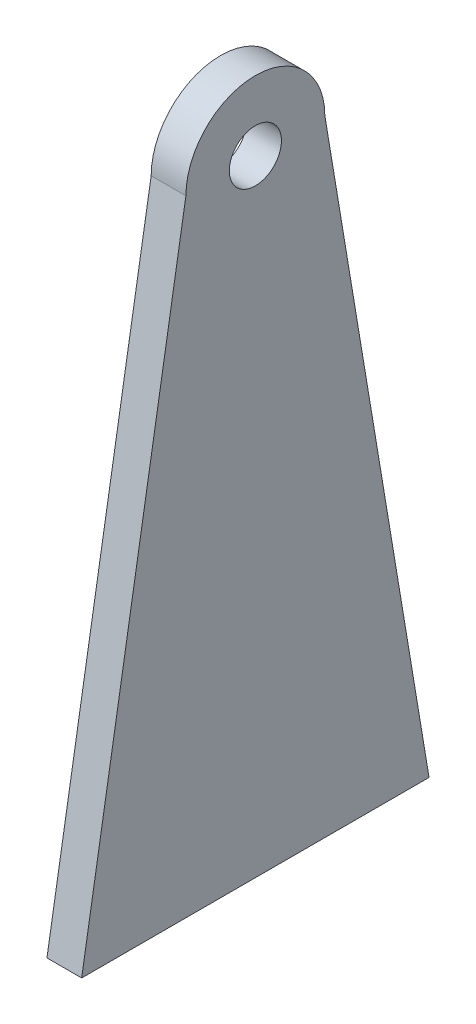
ISO-10303-21;
HEADER;
FILE_DESCRIPTION(('STEP AP214'),'2;1');
FILE_NAME('part.step','',(''),(''),'','','');
FILE_SCHEMA(('AUTOMOTIVE_DESIGN { 1 0 10303 214 1 1 1 1 }'));
ENDSEC;
DATA;
#1=APPLICATION_CONTEXT('core data for automotive mechanical design processes');
#2=APPLICATION_PROTOCOL_DEFINITION('international standard','automotive_design',2000,#1);
#3=PRODUCT_CONTEXT('',#1,'mechanical');
#4=PRODUCT('Part','Part','',(#3));
#5=PRODUCT_RELATED_PRODUCT_CATEGORY('part','',(#4));
#6=PRODUCT_DEFINITION_FORMATION('','',#4);
#7=PRODUCT_DEFINITION_CONTEXT('part definition',#1,'design');
#8=PRODUCT_DEFINITION('design','',#6,#7);
#9=PRODUCT_DEFINITION_SHAPE('','',#8);
#10=(LENGTH_UNIT() NAMED_UNIT(*) SI_UNIT(.MILLI.,.METRE.));
#11=(NAMED_UNIT(*) PLANE_ANGLE_UNIT() SI_UNIT($,.RADIAN.));
#12=(NAMED_UNIT(*) SI_UNIT($,.STERADIAN.) SOLID_ANGLE_UNIT());
#13=UNCERTAINTY_MEASURE_WITH_UNIT(LENGTH_MEASURE(1.E-05),#10,'distance_accuracy_value','');
#14=(GEOMETRIC_REPRESENTATION_CONTEXT(3) GLOBAL_UNCERTAINTY_ASSIGNED_CONTEXT((#13)) GLOBAL_UNIT_ASSIGNED_CONTEXT((#10,
#11,#12)) REPRESENTATION_CONTEXT('',''));
#15=CARTESIAN_POINT('',(0.,0.,0.));
#16=DIRECTION('',(0.,0.,1.));
#17=DIRECTION('',(1.,0.,0.));
#18=AXIS2_PLACEMENT_3D('',#15,#16,#17);
#19=CARTESIAN_POINT('',(5.,180.,0.));
#20=DIRECTION('',(1.,0.,0.));
#21=DIRECTION('',(0.,0.,-1.));
#22=AXIS2_PLACEMENT_3D('',#19,#20,#21);
#23=PLANE('',#22);
#24=DIRECTION('',(0.,0.986393923832144,0.164398987305357));
#25=VECTOR('',#24,1.);
#26=CARTESIAN_POINT('',(5.,0.,-50.));
#27=LINE('',#26,#25);
#28=CARTESIAN_POINT('',(5.,0.,-50.));
#29=VERTEX_POINT('',#28);
#30=CARTESIAN_POINT('',(5.,180.,-20.));
#31=VERTEX_POINT('',#30);
#32=EDGE_CURVE('E151',#29,#31,#27,.T.);
#33=ORIENTED_EDGE('',*,*,#32,.T.);
#34=CARTESIAN_POINT('',(5.,180.,0.));
#35=DIRECTION('',(1.,0.,0.));
#36=DIRECTION('',(0.,0.,-1.));
#37=AXIS2_PLACEMENT_3D('',#34,#35,#36);
#38=CIRCLE('',#37,20.);
#39=CARTESIAN_POINT('',(5.,180.,20.));
#40=VERTEX_POINT('',#39);
#41=EDGE_CURVE('E84',#31,#40,#38,.T.);
#42=ORIENTED_EDGE('',*,*,#41,.T.);
#43=DIRECTION('',(0.,-0.986393923832144,0.164398987305357));
#44=VECTOR('',#43,1.);
#45=CARTESIAN_POINT('',(5.,0.,50.));
#46=LINE('',#45,#44);
#47=CARTESIAN_POINT('',(5.,0.,50.));
#48=VERTEX_POINT('',#47);
#49=EDGE_CURVE('E154',#40,#48,#46,.T.);
#50=ORIENTED_EDGE('',*,*,#49,.T.);
#51=DIRECTION('',(0.,0.,-1.));
#52=VECTOR('',#51,1.);
#53=CARTESIAN_POINT('',(5.,0.,-50.));
#54=LINE('',#53,#52);
#55=EDGE_CURVE('E56',#48,#29,#54,.T.);
#56=ORIENTED_EDGE('',*,*,#55,.T.);
#57=EDGE_LOOP('',(#33,#42,#50,#56));
#58=FACE_BOUND('',#57,.T.);
#59=CARTESIAN_POINT('',(5.,180.,0.));
#60=DIRECTION('',(1.,0.,0.));
#61=DIRECTION('',(0.,0.,-1.));
#62=AXIS2_PLACEMENT_3D('',#59,#60,#61);
#63=CIRCLE('',#62,7.5);
#64=CARTESIAN_POINT('',(5.,180.,-7.5));
#65=VERTEX_POINT('',#64);
#66=EDGE_CURVE('E145',#65,#65,#63,.T.);
#67=ORIENTED_EDGE('',*,*,#66,.F.);
#68=EDGE_LOOP('',(#67));
#69=FACE_BOUND('',#68,.T.);
#70=ADVANCED_FACE('F32',(#58,#69),#23,.T.);
#71=CARTESIAN_POINT('',(-5.,180.,0.));
#72=DIRECTION('',(1.,0.,0.));
#73=DIRECTION('',(0.,0.,-1.));
#74=AXIS2_PLACEMENT_3D('',#71,#72,#73);
#75=PLANE('',#74);
#76=DIRECTION('',(0.,1.,0.));
#77=VECTOR('',#76,1.);
#78=CARTESIAN_POINT('',(-5.,39.,35.));
#79=LINE('',#78,#77);
#80=CARTESIAN_POINT('',(-5.,33.,35.));
#81=VERTEX_POINT('',#80);
#82=CARTESIAN_POINT('',(-5.,39.,35.));
#83=VERTEX_POINT('',#82);
#84=EDGE_CURVE('E132',#81,#83,#79,.T.);
#85=ORIENTED_EDGE('',*,*,#84,.F.);
#86=DIRECTION('',(0.,0.,1.));
#87=VECTOR('',#86,1.);
#88=CARTESIAN_POINT('',(-5.,33.,0.));
#89=LINE('',#88,#87);
#90=CARTESIAN_POINT('',(-5.,33.,-35.));
#91=VERTEX_POINT('',#90);
#92=EDGE_CURVE('E110',#91,#81,#89,.T.);
#93=ORIENTED_EDGE('',*,*,#92,.F.);
#94=DIRECTION('',(0.,-1.,0.));
#95=VECTOR('',#94,1.);
#96=CARTESIAN_POINT('',(-5.,33.,-35.));
#97=LINE('',#96,#95);
#98=CARTESIAN_POINT('',(-5.,39.,-35.));
#99=VERTEX_POINT('',#98);
#100=EDGE_CURVE('E127',#99,#91,#97,.T.);
#101=ORIENTED_EDGE('',*,*,#100,.F.);
#102=DIRECTION('',(0.,0.,-1.));
#103=VECTOR('',#102,1.);
#104=CARTESIAN_POINT('',(-5.,39.,-35.));
#105=LINE('',#104,#103);
#106=EDGE_CURVE('E134',#83,#99,#105,.T.);
#107=ORIENTED_EDGE('',*,*,#106,.F.);
#108=EDGE_LOOP('',(#85,#93,#101,#107));
#109=FACE_BOUND('',#108,.T.);
#110=DIRECTION('',(0.,0.986393923832144,0.164398987305357));
#111=VECTOR('',#110,1.);
#112=CARTESIAN_POINT('',(-5.,0.,-50.));
#113=LINE('',#112,#111);
#114=CARTESIAN_POINT('',(-5.,0.,-50.));
#115=VERTEX_POINT('',#114);
#116=CARTESIAN_POINT('',(-5.,180.,-20.));
#117=VERTEX_POINT('',#116);
#118=EDGE_CURVE('E148',#115,#117,#113,.T.);
#119=ORIENTED_EDGE('',*,*,#118,.F.);
#120=DIRECTION('',(0.,0.,-1.));
#121=VECTOR('',#120,1.);
#122=CARTESIAN_POINT('',(-5.,0.,-50.));
#123=LINE('',#122,#121);
#124=CARTESIAN_POINT('',(-5.,0.,50.));
#125=VERTEX_POINT('',#124);
#126=EDGE_CURVE('E77',#125,#115,#123,.T.);
#127=ORIENTED_EDGE('',*,*,#126,.F.);
#128=DIRECTION('',(0.,-0.986393923832144,0.164398987305357));
#129=VECTOR('',#128,1.);
#130=CARTESIAN_POINT('',(-5.,0.,50.));
#131=LINE('',#130,#129);
#132=CARTESIAN_POINT('',(-5.,180.,20.));
#133=VERTEX_POINT('',#132);
#134=EDGE_CURVE('E162',#133,#125,#131,.T.);
#135=ORIENTED_EDGE('',*,*,#134,.F.);
#136=CARTESIAN_POINT('',(-5.,180.,0.));
#137=DIRECTION('',(1.,0.,0.));
#138=DIRECTION('',(0.,0.,-1.));
#139=AXIS2_PLACEMENT_3D('',#136,#137,#138);
#140=CIRCLE('',#139,20.);
#141=EDGE_CURVE('E160',#117,#133,#140,.T.);
#142=ORIENTED_EDGE('',*,*,#141,.F.);
#143=EDGE_LOOP('',(#119,#127,#135,#142));
#144=FACE_BOUND('',#143,.T.);
#145=CARTESIAN_POINT('',(-5.,180.,0.));
#146=DIRECTION('',(1.,0.,0.));
#147=DIRECTION('',(0.,0.,-1.));
#148=AXIS2_PLACEMENT_3D('',#145,#146,#147);
#149=CIRCLE('',#148,7.5);
#150=CARTESIAN_POINT('',(-5.,180.,-7.5));
#151=VERTEX_POINT('',#150);
#152=EDGE_CURVE('E141',#151,#151,#149,.T.);
#153=ORIENTED_EDGE('',*,*,#152,.T.);
#154=EDGE_LOOP('',(#153));
#155=FACE_BOUND('',#154,.T.);
#156=ADVANCED_FACE('F175',(#109,#144,#155),#75,.F.);
#157=CARTESIAN_POINT('',(5.,0.,-50.));
#158=DIRECTION('',(0.,-0.164398987305357,0.986393923832144));
#159=DIRECTION('',(0.,-0.986393923832144,-0.164398987305357));
#160=AXIS2_PLACEMENT_3D('',#157,#158,#159);
#161=PLANE('',#160);
#162=ORIENTED_EDGE('',*,*,#118,.T.);
#163=DIRECTION('',(-1.,0.,0.));
#164=VECTOR('',#163,1.);
#165=CARTESIAN_POINT('',(5.,180.,-20.));
#166=LINE('',#165,#164);
#167=EDGE_CURVE('E11',#31,#117,#166,.T.);
#168=ORIENTED_EDGE('',*,*,#167,.F.);
#169=ORIENTED_EDGE('',*,*,#32,.F.);
#170=DIRECTION('',(-1.,0.,0.));
#171=VECTOR('',#170,1.);
#172=CARTESIAN_POINT('',(5.,0.,-50.));
#173=LINE('',#172,#171);
#174=EDGE_CURVE('E157',#29,#115,#173,.T.);
#175=ORIENTED_EDGE('',*,*,#174,.T.);
#176=EDGE_LOOP('',(#162,#168,#169,#175));
#177=FACE_BOUND('',#176,.T.);
#178=ADVANCED_FACE('F34',(#177),#161,.F.);
#179=CARTESIAN_POINT('',(5.,180.,0.));
#180=DIRECTION('',(-1.,0.,0.));
#181=DIRECTION('',(0.,0.,1.));
#182=AXIS2_PLACEMENT_3D('',#179,#180,#181);
#183=CYLINDRICAL_SURFACE('',#182,20.);
#184=ORIENTED_EDGE('',*,*,#141,.T.);
#185=DIRECTION('',(-1.,0.,0.));
#186=VECTOR('',#185,1.);
#187=CARTESIAN_POINT('',(5.,180.,20.));
#188=LINE('',#187,#186);
#189=EDGE_CURVE('E40',#40,#133,#188,.T.);
#190=ORIENTED_EDGE('',*,*,#189,.F.);
#191=ORIENTED_EDGE('',*,*,#41,.F.);
#192=ORIENTED_EDGE('',*,*,#167,.T.);
#193=EDGE_LOOP('',(#184,#190,#191,#192));
#194=FACE_BOUND('',#193,.T.);
#195=ADVANCED_FACE('F190',(#194),#183,.T.);
#196=CARTESIAN_POINT('',(5.,0.,50.));
#197=DIRECTION('',(0.,-0.164398987305357,-0.986393923832144));
#198=DIRECTION('',(0.,0.986393923832144,-0.164398987305357));
#199=AXIS2_PLACEMENT_3D('',#196,#197,#198);
#200=PLANE('',#199);
#201=ORIENTED_EDGE('',*,*,#134,.T.);
#202=DIRECTION('',(-1.,0.,0.));
#203=VECTOR('',#202,1.);
#204=CARTESIAN_POINT('',(5.,0.,50.));
#205=LINE('',#204,#203);
#206=EDGE_CURVE('E166',#48,#125,#205,.T.);
#207=ORIENTED_EDGE('',*,*,#206,.F.);
#208=ORIENTED_EDGE('',*,*,#49,.F.);
#209=ORIENTED_EDGE('',*,*,#189,.T.);
#210=EDGE_LOOP('',(#201,#207,#208,#209));
#211=FACE_BOUND('',#210,.T.);
#212=ADVANCED_FACE('F171',(#211),#200,.F.);
#213=CARTESIAN_POINT('',(5.,0.,-50.));
#214=DIRECTION('',(0.,1.,0.));
#215=DIRECTION('',(0.,0.,1.));
#216=AXIS2_PLACEMENT_3D('',#213,#214,#215);
#217=PLANE('',#216);
#218=ORIENTED_EDGE('',*,*,#126,.T.);
#219=ORIENTED_EDGE('',*,*,#174,.F.);
#220=ORIENTED_EDGE('',*,*,#55,.F.);
#221=ORIENTED_EDGE('',*,*,#206,.T.);
#222=EDGE_LOOP('',(#218,#219,#220,#221));
#223=FACE_BOUND('',#222,.T.);
#224=ADVANCED_FACE('F180',(#223),#217,.F.);
#225=CARTESIAN_POINT('',(5.,180.,0.));
#226=DIRECTION('',(-1.,0.,0.));
#227=DIRECTION('',(0.,0.,1.));
#228=AXIS2_PLACEMENT_3D('',#225,#226,#227);
#229=CYLINDRICAL_SURFACE('',#228,7.5);
#230=ORIENTED_EDGE('',*,*,#66,.T.);
#231=EDGE_LOOP('',(#230));
#232=FACE_BOUND('',#231,.T.);
#233=ORIENTED_EDGE('',*,*,#152,.F.);
#234=EDGE_LOOP('',(#233));
#235=FACE_BOUND('',#234,.T.);
#236=ADVANCED_FACE('F182',(#232,#235),#229,.F.);
#237=CARTESIAN_POINT('',(-1.,33.,0.));
#238=DIRECTION('',(0.,-1.,0.));
#239=DIRECTION('',(0.,0.,-1.));
#240=AXIS2_PLACEMENT_3D('',#237,#238,#239);
#241=PLANE('',#240);
#242=ORIENTED_EDGE('',*,*,#92,.T.);
#243=DIRECTION('',(-1.,0.,0.));
#244=VECTOR('',#243,1.);
#245=CARTESIAN_POINT('',(-1.,33.,35.));
#246=LINE('',#245,#244);
#247=CARTESIAN_POINT('',(-1.,33.,35.));
#248=VERTEX_POINT('',#247);
#249=EDGE_CURVE('E47',#248,#81,#246,.T.);
#250=ORIENTED_EDGE('',*,*,#249,.F.);
#251=DIRECTION('',(0.,0.,1.));
#252=VECTOR('',#251,1.);
#253=CARTESIAN_POINT('',(-1.,33.,0.));
#254=LINE('',#253,#252);
#255=CARTESIAN_POINT('',(-1.,33.,-35.));
#256=VERTEX_POINT('',#255);
#257=EDGE_CURVE('E107',#256,#248,#254,.T.);
#258=ORIENTED_EDGE('',*,*,#257,.F.);
#259=DIRECTION('',(-1.,0.,0.));
#260=VECTOR('',#259,1.);
#261=CARTESIAN_POINT('',(-1.,33.,-35.));
#262=LINE('',#261,#260);
#263=EDGE_CURVE('E139',#256,#91,#262,.T.);
#264=ORIENTED_EDGE('',*,*,#263,.T.);
#265=EDGE_LOOP('',(#242,#250,#258,#264));
#266=FACE_BOUND('',#265,.T.);
#267=ADVANCED_FACE('F105',(#266),#241,.F.);
#268=CARTESIAN_POINT('',(-1.,33.,-35.));
#269=DIRECTION('',(0.,0.,-1.));
#270=DIRECTION('',(-1.,0.,0.));
#271=AXIS2_PLACEMENT_3D('',#268,#269,#270);
#272=PLANE('',#271);
#273=ORIENTED_EDGE('',*,*,#100,.T.);
#274=ORIENTED_EDGE('',*,*,#263,.F.);
#275=DIRECTION('',(0.,-1.,0.));
#276=VECTOR('',#275,1.);
#277=CARTESIAN_POINT('',(-1.,33.,-35.));
#278=LINE('',#277,#276);
#279=CARTESIAN_POINT('',(-1.,39.,-35.));
#280=VERTEX_POINT('',#279);
#281=EDGE_CURVE('E113',#280,#256,#278,.T.);
#282=ORIENTED_EDGE('',*,*,#281,.F.);
#283=DIRECTION('',(-1.,0.,0.));
#284=VECTOR('',#283,1.);
#285=CARTESIAN_POINT('',(-1.,39.,-35.));
#286=LINE('',#285,#284);
#287=EDGE_CURVE('E142',#280,#99,#286,.T.);
#288=ORIENTED_EDGE('',*,*,#287,.T.);
#289=EDGE_LOOP('',(#273,#274,#282,#288));
#290=FACE_BOUND('',#289,.T.);
#291=ADVANCED_FACE('F207',(#290),#272,.F.);
#292=CARTESIAN_POINT('',(-1.,39.,-35.));
#293=DIRECTION('',(0.,1.,0.));
#294=DIRECTION('',(0.,0.,1.));
#295=AXIS2_PLACEMENT_3D('',#292,#293,#294);
#296=PLANE('',#295);
#297=ORIENTED_EDGE('',*,*,#106,.T.);
#298=ORIENTED_EDGE('',*,*,#287,.F.);
#299=DIRECTION('',(0.,0.,-1.));
#300=VECTOR('',#299,1.);
#301=CARTESIAN_POINT('',(-1.,39.,-35.));
#302=LINE('',#301,#300);
#303=CARTESIAN_POINT('',(-1.,39.,35.));
#304=VERTEX_POINT('',#303);
#305=EDGE_CURVE('E121',#304,#280,#302,.T.);
#306=ORIENTED_EDGE('',*,*,#305,.F.);
#307=DIRECTION('',(-1.,0.,0.));
#308=VECTOR('',#307,1.);
#309=CARTESIAN_POINT('',(-1.,39.,35.));
#310=LINE('',#309,#308);
#311=EDGE_CURVE('E112',#304,#83,#310,.T.);
#312=ORIENTED_EDGE('',*,*,#311,.T.);
#313=EDGE_LOOP('',(#297,#298,#306,#312));
#314=FACE_BOUND('',#313,.T.);
#315=ADVANCED_FACE('F204',(#314),#296,.F.);
#316=CARTESIAN_POINT('',(-1.,39.,35.));
#317=DIRECTION('',(0.,0.,1.));
#318=DIRECTION('',(1.,0.,0.));
#319=AXIS2_PLACEMENT_3D('',#316,#317,#318);
#320=PLANE('',#319);
#321=ORIENTED_EDGE('',*,*,#84,.T.);
#322=ORIENTED_EDGE('',*,*,#311,.F.);
#323=DIRECTION('',(0.,1.,0.));
#324=VECTOR('',#323,1.);
#325=CARTESIAN_POINT('',(-1.,39.,35.));
#326=LINE('',#325,#324);
#327=EDGE_CURVE('E116',#248,#304,#326,.T.);
#328=ORIENTED_EDGE('',*,*,#327,.F.);
#329=ORIENTED_EDGE('',*,*,#249,.T.);
#330=EDGE_LOOP('',(#321,#322,#328,#329));
#331=FACE_BOUND('',#330,.T.);
#332=ADVANCED_FACE('F117',(#331),#320,.F.);
#333=CARTESIAN_POINT('',(-1.,0.,0.));
#334=DIRECTION('',(1.,0.,0.));
#335=DIRECTION('',(0.,0.,-1.));
#336=AXIS2_PLACEMENT_3D('',#333,#334,#335);
#337=PLANE('',#336);
#338=ORIENTED_EDGE('',*,*,#257,.T.);
#339=ORIENTED_EDGE('',*,*,#327,.T.);
#340=ORIENTED_EDGE('',*,*,#305,.T.);
#341=ORIENTED_EDGE('',*,*,#281,.T.);
#342=EDGE_LOOP('',(#338,#339,#340,#341));
#343=FACE_BOUND('',#342,.T.);
#344=ADVANCED_FACE('F124',(#343),#337,.F.);
#345=CLOSED_SHELL('',(#70,#156,#178,#195,#212,#224,#236,#267,#291,#315,#332,#344));
#346=MANIFOLD_SOLID_BREP('B2',#345);
#347=ADVANCED_BREP_SHAPE_REPRESENTATION('',(#18,#346),#14);
#348=SHAPE_DEFINITION_REPRESENTATION(#9,#347);
ENDSEC;
END-ISO-10303-21;
